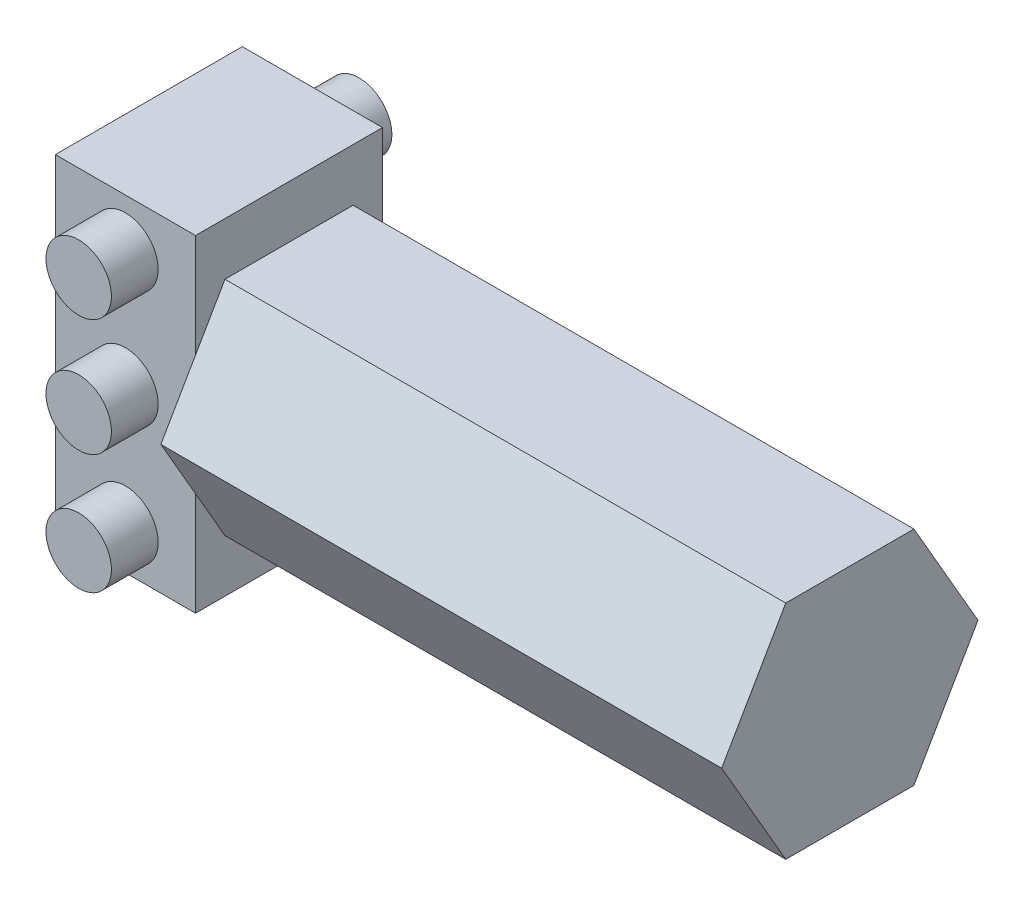
ISO-10303-21;
HEADER;
FILE_DESCRIPTION(('STEP AP214'),'2;1');
FILE_NAME('part.step','',(''),(''),'','','');
FILE_SCHEMA(('AUTOMOTIVE_DESIGN { 1 0 10303 214 1 1 1 1 }'));
ENDSEC;
DATA;
#1=APPLICATION_CONTEXT('core data for automotive mechanical design processes');
#2=APPLICATION_PROTOCOL_DEFINITION('international standard','automotive_design',2000,#1);
#3=PRODUCT_CONTEXT('',#1,'mechanical');
#4=PRODUCT('Part','Part','',(#3));
#5=PRODUCT_RELATED_PRODUCT_CATEGORY('part','',(#4));
#6=PRODUCT_DEFINITION_FORMATION('','',#4);
#7=PRODUCT_DEFINITION_CONTEXT('part definition',#1,'design');
#8=PRODUCT_DEFINITION('design','',#6,#7);
#9=PRODUCT_DEFINITION_SHAPE('','',#8);
#10=(LENGTH_UNIT() NAMED_UNIT(*) SI_UNIT(.MILLI.,.METRE.));
#11=(NAMED_UNIT(*) PLANE_ANGLE_UNIT() SI_UNIT($,.RADIAN.));
#12=(NAMED_UNIT(*) SI_UNIT($,.STERADIAN.) SOLID_ANGLE_UNIT());
#13=UNCERTAINTY_MEASURE_WITH_UNIT(LENGTH_MEASURE(1.E-05),#10,'distance_accuracy_value','');
#14=(GEOMETRIC_REPRESENTATION_CONTEXT(3) GLOBAL_UNCERTAINTY_ASSIGNED_CONTEXT((#13)) GLOBAL_UNIT_ASSIGNED_CONTEXT((#10,
#11,#12)) REPRESENTATION_CONTEXT('',''));
#15=CARTESIAN_POINT('',(0.,0.,0.));
#16=DIRECTION('',(0.,0.,1.));
#17=DIRECTION('',(1.,0.,0.));
#18=AXIS2_PLACEMENT_3D('',#15,#16,#17);
#19=CARTESIAN_POINT('',(7.62,0.,10.16));
#20=DIRECTION('',(-1.,0.,0.));
#21=DIRECTION('',(0.,0.,1.));
#22=AXIS2_PLACEMENT_3D('',#19,#20,#21);
#23=PLANE('',#22);
#24=DIRECTION('',(0.,0.866025403784439,-0.5));
#25=VECTOR('',#24,1.);
#26=CARTESIAN_POINT('',(7.62,2.85753030896035,1.597152));
#27=LINE('',#26,#25);
#28=CARTESIAN_POINT('',(7.62,2.85753030896035,1.597152));
#29=VERTEX_POINT('',#28);
#30=CARTESIAN_POINT('',(7.62,5.62387872037061,0.));
#31=VERTEX_POINT('',#30);
#32=EDGE_CURVE('E59',#29,#31,#27,.T.);
#33=ORIENTED_EDGE('',*,*,#32,.F.);
#34=DIRECTION('',(0.,0.,-1.));
#35=VECTOR('',#34,1.);
#36=CARTESIAN_POINT('',(7.62,2.85753030896035,8.56284799999999));
#37=LINE('',#36,#35);
#38=CARTESIAN_POINT('',(7.62,2.85753030896035,8.56284799999999));
#39=VERTEX_POINT('',#38);
#40=EDGE_CURVE('E63',#39,#29,#37,.T.);
#41=ORIENTED_EDGE('',*,*,#40,.F.);
#42=DIRECTION('',(0.,-0.866025403784439,-0.5));
#43=VECTOR('',#42,1.);
#44=CARTESIAN_POINT('',(7.62,8.89,12.045696));
#45=LINE('',#44,#43);
#46=CARTESIAN_POINT('',(7.62,5.62387872037061,10.16));
#47=VERTEX_POINT('',#46);
#48=EDGE_CURVE('E218',#47,#39,#45,.T.);
#49=ORIENTED_EDGE('',*,*,#48,.F.);
#50=DIRECTION('',(0.,1.,0.));
#51=VECTOR('',#50,1.);
#52=CARTESIAN_POINT('',(7.62,0.,10.16));
#53=LINE('',#52,#51);
#54=CARTESIAN_POINT('',(7.62,0.,10.16));
#55=VERTEX_POINT('',#54);
#56=EDGE_CURVE('E181',#55,#47,#53,.T.);
#57=ORIENTED_EDGE('',*,*,#56,.F.);
#58=DIRECTION('',(0.,0.,-1.));
#59=VECTOR('',#58,1.);
#60=CARTESIAN_POINT('',(7.62,0.,10.16));
#61=LINE('',#60,#59);
#62=CARTESIAN_POINT('',(7.62,0.,0.));
#63=VERTEX_POINT('',#62);
#64=EDGE_CURVE('E206',#55,#63,#61,.T.);
#65=ORIENTED_EDGE('',*,*,#64,.T.);
#66=DIRECTION('',(0.,1.,0.));
#67=VECTOR('',#66,1.);
#68=CARTESIAN_POINT('',(7.62,0.,0.));
#69=LINE('',#68,#67);
#70=EDGE_CURVE('E193',#63,#31,#69,.T.);
#71=ORIENTED_EDGE('',*,*,#70,.T.);
#72=EDGE_LOOP('',(#33,#41,#49,#57,#65,#71));
#73=FACE_BOUND('',#72,.T.);
#74=ADVANCED_FACE('F43',(#73),#23,.F.);
#75=DIRECTION('',(0.,-0.866025403784439,0.5));
#76=VECTOR('',#75,1.);
#77=CARTESIAN_POINT('',(7.62,14.9224696910396,8.56284799999999));
#78=LINE('',#77,#76);
#79=CARTESIAN_POINT('',(7.62,14.9224696910396,8.56284799999999));
#80=VERTEX_POINT('',#79);
#81=CARTESIAN_POINT('',(7.62,12.1561212796294,10.16));
#82=VERTEX_POINT('',#81);
#83=EDGE_CURVE('E265',#80,#82,#78,.T.);
#84=ORIENTED_EDGE('',*,*,#83,.F.);
#85=DIRECTION('',(0.,0.,1.));
#86=VECTOR('',#85,1.);
#87=CARTESIAN_POINT('',(7.62,14.9224696910396,1.597152));
#88=LINE('',#87,#86);
#89=CARTESIAN_POINT('',(7.62,14.9224696910396,1.597152));
#90=VERTEX_POINT('',#89);
#91=EDGE_CURVE('E278',#90,#80,#88,.T.);
#92=ORIENTED_EDGE('',*,*,#91,.F.);
#93=DIRECTION('',(0.,0.866025403784439,0.5));
#94=VECTOR('',#93,1.);
#95=CARTESIAN_POINT('',(7.62,8.89,-1.88569599999999));
#96=LINE('',#95,#94);
#97=CARTESIAN_POINT('',(7.62,12.1561212796294,0.));
#98=VERTEX_POINT('',#97);
#99=EDGE_CURVE('E214',#98,#90,#96,.T.);
#100=ORIENTED_EDGE('',*,*,#99,.F.);
#101=CARTESIAN_POINT('',(7.62,17.78,0.));
#102=VERTEX_POINT('',#101);
#103=EDGE_CURVE('E192',#98,#102,#69,.T.);
#104=ORIENTED_EDGE('',*,*,#103,.T.);
#105=DIRECTION('',(0.,0.,-1.));
#106=VECTOR('',#105,1.);
#107=CARTESIAN_POINT('',(7.62,17.78,10.16));
#108=LINE('',#107,#106);
#109=CARTESIAN_POINT('',(7.62,17.78,10.16));
#110=VERTEX_POINT('',#109);
#111=EDGE_CURVE('E202',#110,#102,#108,.T.);
#112=ORIENTED_EDGE('',*,*,#111,.F.);
#113=EDGE_CURVE('E180',#82,#110,#53,.T.);
#114=ORIENTED_EDGE('',*,*,#113,.F.);
#115=EDGE_LOOP('',(#84,#92,#100,#104,#112,#114));
#116=FACE_BOUND('',#115,.T.);
#117=ADVANCED_FACE('F348',(#116),#23,.F.);
#118=CARTESIAN_POINT('',(0.,0.,10.16));
#119=DIRECTION('',(1.,0.,0.));
#120=DIRECTION('',(0.,0.,-1.));
#121=AXIS2_PLACEMENT_3D('',#118,#119,#120);
#122=PLANE('',#121);
#123=DIRECTION('',(0.,-1.,0.));
#124=VECTOR('',#123,1.);
#125=CARTESIAN_POINT('',(0.,0.,0.));
#126=LINE('',#125,#124);
#127=CARTESIAN_POINT('',(0.,17.78,0.));
#128=VERTEX_POINT('',#127);
#129=CARTESIAN_POINT('',(0.,0.,0.));
#130=VERTEX_POINT('',#129);
#131=EDGE_CURVE('E161',#128,#130,#126,.T.);
#132=ORIENTED_EDGE('',*,*,#131,.T.);
#133=DIRECTION('',(0.,0.,-1.));
#134=VECTOR('',#133,1.);
#135=CARTESIAN_POINT('',(0.,0.,10.16));
#136=LINE('',#135,#134);
#137=CARTESIAN_POINT('',(0.,0.,10.16));
#138=VERTEX_POINT('',#137);
#139=EDGE_CURVE('E210',#138,#130,#136,.T.);
#140=ORIENTED_EDGE('',*,*,#139,.F.);
#141=DIRECTION('',(0.,-1.,0.));
#142=VECTOR('',#141,1.);
#143=CARTESIAN_POINT('',(0.,0.,10.16));
#144=LINE('',#143,#142);
#145=CARTESIAN_POINT('',(0.,17.78,10.16));
#146=VERTEX_POINT('',#145);
#147=EDGE_CURVE('E172',#146,#138,#144,.T.);
#148=ORIENTED_EDGE('',*,*,#147,.F.);
#149=DIRECTION('',(0.,0.,-1.));
#150=VECTOR('',#149,1.);
#151=CARTESIAN_POINT('',(0.,17.78,10.16));
#152=LINE('',#151,#150);
#153=EDGE_CURVE('E188',#146,#128,#152,.T.);
#154=ORIENTED_EDGE('',*,*,#153,.T.);
#155=EDGE_LOOP('',(#132,#140,#148,#154));
#156=FACE_BOUND('',#155,.T.);
#157=ADVANCED_FACE('F45',(#156),#122,.F.);
#158=CARTESIAN_POINT('',(0.,0.,10.16));
#159=DIRECTION('',(0.,1.,0.));
#160=DIRECTION('',(0.,0.,1.));
#161=AXIS2_PLACEMENT_3D('',#158,#159,#160);
#162=PLANE('',#161);
#163=DIRECTION('',(1.,0.,0.));
#164=VECTOR('',#163,1.);
#165=CARTESIAN_POINT('',(0.,0.,0.));
#166=LINE('',#165,#164);
#167=EDGE_CURVE('E166',#130,#63,#166,.T.);
#168=ORIENTED_EDGE('',*,*,#167,.T.);
#169=ORIENTED_EDGE('',*,*,#64,.F.);
#170=DIRECTION('',(1.,0.,0.));
#171=VECTOR('',#170,1.);
#172=CARTESIAN_POINT('',(0.,0.,10.16));
#173=LINE('',#172,#171);
#174=EDGE_CURVE('E176',#138,#55,#173,.T.);
#175=ORIENTED_EDGE('',*,*,#174,.F.);
#176=ORIENTED_EDGE('',*,*,#139,.T.);
#177=EDGE_LOOP('',(#168,#169,#175,#176));
#178=FACE_BOUND('',#177,.T.);
#179=ADVANCED_FACE('F242',(#178),#162,.F.);
#180=CARTESIAN_POINT('',(0.,17.78,10.16));
#181=DIRECTION('',(0.,-1.,0.));
#182=DIRECTION('',(0.,0.,-1.));
#183=AXIS2_PLACEMENT_3D('',#180,#181,#182);
#184=PLANE('',#183);
#185=DIRECTION('',(-1.,0.,0.));
#186=VECTOR('',#185,1.);
#187=CARTESIAN_POINT('',(0.,17.78,0.));
#188=LINE('',#187,#186);
#189=EDGE_CURVE('E177',#102,#128,#188,.T.);
#190=ORIENTED_EDGE('',*,*,#189,.T.);
#191=ORIENTED_EDGE('',*,*,#153,.F.);
#192=DIRECTION('',(-1.,0.,0.));
#193=VECTOR('',#192,1.);
#194=CARTESIAN_POINT('',(0.,17.78,10.16));
#195=LINE('',#194,#193);
#196=EDGE_CURVE('E185',#110,#146,#195,.T.);
#197=ORIENTED_EDGE('',*,*,#196,.F.);
#198=ORIENTED_EDGE('',*,*,#111,.T.);
#199=EDGE_LOOP('',(#190,#191,#197,#198));
#200=FACE_BOUND('',#199,.T.);
#201=ADVANCED_FACE('F229',(#200),#184,.F.);
#202=CARTESIAN_POINT('',(0.,0.,10.16));
#203=DIRECTION('',(0.,0.,-1.));
#204=DIRECTION('',(-1.,0.,0.));
#205=AXIS2_PLACEMENT_3D('',#202,#203,#204);
#206=PLANE('',#205);
#207=CARTESIAN_POINT('',(3.81,2.31394822006476,10.16));
#208=DIRECTION('',(0.,0.,-1.));
#209=DIRECTION('',(-1.,0.,0.));
#210=AXIS2_PLACEMENT_3D('',#207,#208,#209);
#211=CIRCLE('',#210,1.778);
#212=CARTESIAN_POINT('',(2.032,2.31394822006476,10.16));
#213=VERTEX_POINT('',#212);
#214=EDGE_CURVE('E11',#213,#213,#211,.F.);
#215=ORIENTED_EDGE('',*,*,#214,.F.);
#216=EDGE_LOOP('',(#215));
#217=FACE_BOUND('',#216,.T.);
#218=CARTESIAN_POINT('',(3.81,8.81714033539279,10.16));
#219=DIRECTION('',(0.,0.,-1.));
#220=DIRECTION('',(-1.,0.,0.));
#221=AXIS2_PLACEMENT_3D('',#218,#219,#220);
#222=CIRCLE('',#221,1.778);
#223=CARTESIAN_POINT('',(2.032,8.81714033539279,10.16));
#224=VERTEX_POINT('',#223);
#225=EDGE_CURVE('E52',#224,#224,#222,.F.);
#226=ORIENTED_EDGE('',*,*,#225,.F.);
#227=EDGE_LOOP('',(#226));
#228=FACE_BOUND('',#227,.T.);
#229=CARTESIAN_POINT('',(3.81,15.1671403353928,10.16));
#230=DIRECTION('',(0.,0.,-1.));
#231=DIRECTION('',(-1.,0.,0.));
#232=AXIS2_PLACEMENT_3D('',#229,#230,#231);
#233=CIRCLE('',#232,1.778);
#234=CARTESIAN_POINT('',(2.032,15.1671403353928,10.16));
#235=VERTEX_POINT('',#234);
#236=EDGE_CURVE('E215',#235,#235,#233,.F.);
#237=ORIENTED_EDGE('',*,*,#236,.F.);
#238=EDGE_LOOP('',(#237));
#239=FACE_BOUND('',#238,.T.);
#240=ORIENTED_EDGE('',*,*,#147,.T.);
#241=ORIENTED_EDGE('',*,*,#174,.T.);
#242=ORIENTED_EDGE('',*,*,#56,.T.);
#243=EDGE_CURVE('E186',#47,#82,#53,.T.);
#244=ORIENTED_EDGE('',*,*,#243,.T.);
#245=ORIENTED_EDGE('',*,*,#113,.T.);
#246=ORIENTED_EDGE('',*,*,#196,.T.);
#247=EDGE_LOOP('',(#240,#241,#242,#244,#245,#246));
#248=FACE_BOUND('',#247,.T.);
#249=ADVANCED_FACE('F225',(#217,#228,#239,#248),#206,.F.);
#250=CARTESIAN_POINT('',(0.,0.,0.));
#251=DIRECTION('',(0.,0.,-1.));
#252=DIRECTION('',(-1.,0.,0.));
#253=AXIS2_PLACEMENT_3D('',#250,#251,#252);
#254=PLANE('',#253);
#255=CARTESIAN_POINT('',(3.81,2.31394822006476,0.));
#256=DIRECTION('',(0.,0.,-1.));
#257=DIRECTION('',(-1.,0.,0.));
#258=AXIS2_PLACEMENT_3D('',#255,#256,#257);
#259=CIRCLE('',#258,1.72135793558427);
#260=CARTESIAN_POINT('',(2.08864206441573,2.31394822006476,0.));
#261=VERTEX_POINT('',#260);
#262=EDGE_CURVE('E308',#261,#261,#259,.T.);
#263=ORIENTED_EDGE('',*,*,#262,.F.);
#264=EDGE_LOOP('',(#263));
#265=FACE_BOUND('',#264,.T.);
#266=CARTESIAN_POINT('',(3.81,8.81714033539279,0.));
#267=DIRECTION('',(0.,0.,-1.));
#268=DIRECTION('',(-1.,0.,0.));
#269=AXIS2_PLACEMENT_3D('',#266,#267,#268);
#270=CIRCLE('',#269,1.778);
#271=CARTESIAN_POINT('',(2.032,8.81714033539279,0.));
#272=VERTEX_POINT('',#271);
#273=EDGE_CURVE('E300',#272,#272,#270,.T.);
#274=ORIENTED_EDGE('',*,*,#273,.F.);
#275=EDGE_LOOP('',(#274));
#276=FACE_BOUND('',#275,.T.);
#277=CARTESIAN_POINT('',(3.81,15.1671403353928,0.));
#278=DIRECTION('',(0.,0.,-1.));
#279=DIRECTION('',(-1.,0.,0.));
#280=AXIS2_PLACEMENT_3D('',#277,#278,#279);
#281=CIRCLE('',#280,1.778);
#282=CARTESIAN_POINT('',(2.032,15.1671403353928,0.));
#283=VERTEX_POINT('',#282);
#284=EDGE_CURVE('E296',#283,#283,#281,.T.);
#285=ORIENTED_EDGE('',*,*,#284,.F.);
#286=EDGE_LOOP('',(#285));
#287=FACE_BOUND('',#286,.T.);
#288=ORIENTED_EDGE('',*,*,#131,.F.);
#289=ORIENTED_EDGE('',*,*,#189,.F.);
#290=ORIENTED_EDGE('',*,*,#103,.F.);
#291=EDGE_CURVE('E196',#31,#98,#69,.T.);
#292=ORIENTED_EDGE('',*,*,#291,.F.);
#293=ORIENTED_EDGE('',*,*,#70,.F.);
#294=ORIENTED_EDGE('',*,*,#167,.F.);
#295=EDGE_LOOP('',(#288,#289,#290,#292,#293,#294));
#296=FACE_BOUND('',#295,.T.);
#297=ADVANCED_FACE('F228',(#265,#276,#287,#296),#254,.T.);
#298=CARTESIAN_POINT('',(7.62,0.,0.));
#299=DIRECTION('',(1.,0.,0.));
#300=DIRECTION('',(0.,0.,-1.));
#301=AXIS2_PLACEMENT_3D('',#298,#299,#300);
#302=PLANE('',#301);
#303=CARTESIAN_POINT('',(7.62,8.89,-1.88569599999999));
#304=VERTEX_POINT('',#303);
#305=EDGE_CURVE('E158',#31,#304,#27,.T.);
#306=ORIENTED_EDGE('',*,*,#305,.F.);
#307=ORIENTED_EDGE('',*,*,#291,.T.);
#308=EDGE_CURVE('E274',#304,#98,#96,.T.);
#309=ORIENTED_EDGE('',*,*,#308,.F.);
#310=EDGE_LOOP('',(#306,#307,#309));
#311=FACE_BOUND('',#310,.T.);
#312=ADVANCED_FACE('F377',(#311),#302,.F.);
#313=CARTESIAN_POINT('',(38.1,2.85753030896035,1.597152));
#314=DIRECTION('',(0.,0.5,0.866025403784439));
#315=DIRECTION('',(0.,-0.866025403784439,0.5));
#316=AXIS2_PLACEMENT_3D('',#313,#314,#315);
#317=PLANE('',#316);
#318=ORIENTED_EDGE('',*,*,#32,.T.);
#319=ORIENTED_EDGE('',*,*,#305,.T.);
#320=DIRECTION('',(-1.,0.,0.));
#321=VECTOR('',#320,1.);
#322=CARTESIAN_POINT('',(38.1,8.89,-1.88569599999999));
#323=LINE('',#322,#321);
#324=CARTESIAN_POINT('',(38.1,8.89,-1.88569599999999));
#325=VERTEX_POINT('',#324);
#326=EDGE_CURVE('E137',#325,#304,#323,.T.);
#327=ORIENTED_EDGE('',*,*,#326,.F.);
#328=DIRECTION('',(0.,0.866025403784439,-0.5));
#329=VECTOR('',#328,1.);
#330=CARTESIAN_POINT('',(38.1,2.85753030896035,1.597152));
#331=LINE('',#330,#329);
#332=CARTESIAN_POINT('',(38.1,2.85753030896035,1.597152));
#333=VERTEX_POINT('',#332);
#334=EDGE_CURVE('E145',#333,#325,#331,.T.);
#335=ORIENTED_EDGE('',*,*,#334,.F.);
#336=DIRECTION('',(-1.,0.,0.));
#337=VECTOR('',#336,1.);
#338=CARTESIAN_POINT('',(38.1,2.85753030896035,1.597152));
#339=LINE('',#338,#337);
#340=EDGE_CURVE('E287',#333,#29,#339,.T.);
#341=ORIENTED_EDGE('',*,*,#340,.T.);
#342=EDGE_LOOP('',(#318,#319,#327,#335,#341));
#343=FACE_BOUND('',#342,.T.);
#344=ADVANCED_FACE('F156',(#343),#317,.F.);
#345=CARTESIAN_POINT('',(38.1,8.89,-1.88569599999999));
#346=DIRECTION('',(0.,-0.5,0.866025403784439));
#347=DIRECTION('',(0.,-0.866025403784439,-0.5));
#348=AXIS2_PLACEMENT_3D('',#345,#346,#347);
#349=PLANE('',#348);
#350=ORIENTED_EDGE('',*,*,#308,.T.);
#351=ORIENTED_EDGE('',*,*,#99,.T.);
#352=DIRECTION('',(-1.,0.,0.));
#353=VECTOR('',#352,1.);
#354=CARTESIAN_POINT('',(38.1,14.9224696910396,1.597152));
#355=LINE('',#354,#353);
#356=CARTESIAN_POINT('',(38.1,14.9224696910396,1.597152));
#357=VERTEX_POINT('',#356);
#358=EDGE_CURVE('E140',#357,#90,#355,.T.);
#359=ORIENTED_EDGE('',*,*,#358,.F.);
#360=DIRECTION('',(0.,0.866025403784439,0.5));
#361=VECTOR('',#360,1.);
#362=CARTESIAN_POINT('',(38.1,8.89,-1.88569599999999));
#363=LINE('',#362,#361);
#364=EDGE_CURVE('E132',#325,#357,#363,.T.);
#365=ORIENTED_EDGE('',*,*,#364,.F.);
#366=ORIENTED_EDGE('',*,*,#326,.T.);
#367=EDGE_LOOP('',(#350,#351,#359,#365,#366));
#368=FACE_BOUND('',#367,.T.);
#369=ADVANCED_FACE('F135',(#368),#349,.F.);
#370=CARTESIAN_POINT('',(38.1,14.9224696910396,1.597152));
#371=DIRECTION('',(0.,-1.,0.));
#372=DIRECTION('',(0.,0.,-1.));
#373=AXIS2_PLACEMENT_3D('',#370,#371,#372);
#374=PLANE('',#373);
#375=ORIENTED_EDGE('',*,*,#91,.T.);
#376=DIRECTION('',(-1.,0.,0.));
#377=VECTOR('',#376,1.);
#378=CARTESIAN_POINT('',(38.1,14.9224696910396,8.56284799999999));
#379=LINE('',#378,#377);
#380=CARTESIAN_POINT('',(38.1,14.9224696910396,8.56284799999999));
#381=VERTEX_POINT('',#380);
#382=EDGE_CURVE('E168',#381,#80,#379,.T.);
#383=ORIENTED_EDGE('',*,*,#382,.F.);
#384=DIRECTION('',(0.,0.,1.));
#385=VECTOR('',#384,1.);
#386=CARTESIAN_POINT('',(38.1,14.9224696910396,1.597152));
#387=LINE('',#386,#385);
#388=EDGE_CURVE('E144',#357,#381,#387,.T.);
#389=ORIENTED_EDGE('',*,*,#388,.F.);
#390=ORIENTED_EDGE('',*,*,#358,.T.);
#391=EDGE_LOOP('',(#375,#383,#389,#390));
#392=FACE_BOUND('',#391,.T.);
#393=ADVANCED_FACE('F403',(#392),#374,.F.);
#394=CARTESIAN_POINT('',(38.1,14.9224696910396,8.56284799999999));
#395=DIRECTION('',(0.,-0.5,-0.866025403784439));
#396=DIRECTION('',(0.,0.866025403784439,-0.5));
#397=AXIS2_PLACEMENT_3D('',#394,#395,#396);
#398=PLANE('',#397);
#399=ORIENTED_EDGE('',*,*,#83,.T.);
#400=CARTESIAN_POINT('',(7.62,8.89,12.045696));
#401=VERTEX_POINT('',#400);
#402=EDGE_CURVE('E253',#82,#401,#78,.T.);
#403=ORIENTED_EDGE('',*,*,#402,.T.);
#404=DIRECTION('',(-1.,0.,0.));
#405=VECTOR('',#404,1.);
#406=CARTESIAN_POINT('',(38.1,8.89,12.045696));
#407=LINE('',#406,#405);
#408=CARTESIAN_POINT('',(38.1,8.89,12.045696));
#409=VERTEX_POINT('',#408);
#410=EDGE_CURVE('E263',#409,#401,#407,.T.);
#411=ORIENTED_EDGE('',*,*,#410,.F.);
#412=DIRECTION('',(0.,-0.866025403784439,0.5));
#413=VECTOR('',#412,1.);
#414=CARTESIAN_POINT('',(38.1,14.9224696910396,8.56284799999999));
#415=LINE('',#414,#413);
#416=EDGE_CURVE('E291',#381,#409,#415,.T.);
#417=ORIENTED_EDGE('',*,*,#416,.F.);
#418=ORIENTED_EDGE('',*,*,#382,.T.);
#419=EDGE_LOOP('',(#399,#403,#411,#417,#418));
#420=FACE_BOUND('',#419,.T.);
#421=ADVANCED_FACE('F413',(#420),#398,.F.);
#422=CARTESIAN_POINT('',(38.1,8.89,12.045696));
#423=DIRECTION('',(0.,0.5,-0.866025403784439));
#424=DIRECTION('',(0.,0.866025403784439,0.5));
#425=AXIS2_PLACEMENT_3D('',#422,#423,#424);
#426=PLANE('',#425);
#427=EDGE_CURVE('E252',#401,#47,#45,.T.);
#428=ORIENTED_EDGE('',*,*,#427,.T.);
#429=ORIENTED_EDGE('',*,*,#48,.T.);
#430=DIRECTION('',(-1.,0.,0.));
#431=VECTOR('',#430,1.);
#432=CARTESIAN_POINT('',(38.1,2.85753030896035,8.56284799999999));
#433=LINE('',#432,#431);
#434=CARTESIAN_POINT('',(38.1,2.85753030896035,8.56284799999999));
#435=VERTEX_POINT('',#434);
#436=EDGE_CURVE('E664',#435,#39,#433,.T.);
#437=ORIENTED_EDGE('',*,*,#436,.F.);
#438=DIRECTION('',(0.,-0.866025403784439,-0.5));
#439=VECTOR('',#438,1.);
#440=CARTESIAN_POINT('',(38.1,8.89,12.045696));
#441=LINE('',#440,#439);
#442=EDGE_CURVE('E288',#409,#435,#441,.T.);
#443=ORIENTED_EDGE('',*,*,#442,.F.);
#444=ORIENTED_EDGE('',*,*,#410,.T.);
#445=EDGE_LOOP('',(#428,#429,#437,#443,#444));
#446=FACE_BOUND('',#445,.T.);
#447=ADVANCED_FACE('F258',(#446),#426,.F.);
#448=CARTESIAN_POINT('',(38.1,2.85753030896035,8.56284799999999));
#449=DIRECTION('',(0.,1.,0.));
#450=DIRECTION('',(0.,0.,1.));
#451=AXIS2_PLACEMENT_3D('',#448,#449,#450);
#452=PLANE('',#451);
#453=ORIENTED_EDGE('',*,*,#40,.T.);
#454=ORIENTED_EDGE('',*,*,#340,.F.);
#455=DIRECTION('',(0.,0.,-1.));
#456=VECTOR('',#455,1.);
#457=CARTESIAN_POINT('',(38.1,2.85753030896035,8.56284799999999));
#458=LINE('',#457,#456);
#459=EDGE_CURVE('E150',#435,#333,#458,.T.);
#460=ORIENTED_EDGE('',*,*,#459,.F.);
#461=ORIENTED_EDGE('',*,*,#436,.T.);
#462=EDGE_LOOP('',(#453,#454,#460,#461));
#463=FACE_BOUND('',#462,.T.);
#464=ADVANCED_FACE('F434',(#463),#452,.F.);
#465=CARTESIAN_POINT('',(38.1,0.,0.));
#466=DIRECTION('',(1.,0.,0.));
#467=DIRECTION('',(0.,0.,-1.));
#468=AXIS2_PLACEMENT_3D('',#465,#466,#467);
#469=PLANE('',#468);
#470=ORIENTED_EDGE('',*,*,#334,.T.);
#471=ORIENTED_EDGE('',*,*,#364,.T.);
#472=ORIENTED_EDGE('',*,*,#388,.T.);
#473=ORIENTED_EDGE('',*,*,#416,.T.);
#474=ORIENTED_EDGE('',*,*,#442,.T.);
#475=ORIENTED_EDGE('',*,*,#459,.T.);
#476=EDGE_LOOP('',(#470,#471,#472,#473,#474,#475));
#477=FACE_BOUND('',#476,.T.);
#478=ADVANCED_FACE('F148',(#477),#469,.T.);
#479=ORIENTED_EDGE('',*,*,#243,.F.);
#480=ORIENTED_EDGE('',*,*,#427,.F.);
#481=ORIENTED_EDGE('',*,*,#402,.F.);
#482=EDGE_LOOP('',(#479,#480,#481));
#483=FACE_BOUND('',#482,.T.);
#484=ADVANCED_FACE('F251',(#483),#302,.F.);
#485=CARTESIAN_POINT('',(3.81,15.1671403353928,-2.54));
#486=DIRECTION('',(0.,0.,1.));
#487=DIRECTION('',(1.,0.,0.));
#488=AXIS2_PLACEMENT_3D('',#485,#486,#487);
#489=CYLINDRICAL_SURFACE('',#488,1.778);
#490=CARTESIAN_POINT('',(3.81,15.1671403353928,-2.54));
#491=DIRECTION('',(0.,0.,-1.));
#492=DIRECTION('',(-1.,0.,0.));
#493=AXIS2_PLACEMENT_3D('',#490,#491,#492);
#494=CIRCLE('',#493,1.778);
#495=CARTESIAN_POINT('',(2.032,15.1671403353928,-2.54));
#496=VERTEX_POINT('',#495);
#497=EDGE_CURVE('E283',#496,#496,#494,.T.);
#498=ORIENTED_EDGE('',*,*,#497,.F.);
#499=EDGE_LOOP('',(#498));
#500=FACE_BOUND('',#499,.T.);
#501=ORIENTED_EDGE('',*,*,#284,.T.);
#502=EDGE_LOOP('',(#501));
#503=FACE_BOUND('',#502,.T.);
#504=ADVANCED_FACE('F463',(#500,#503),#489,.T.);
#505=CARTESIAN_POINT('',(3.81,15.1671403353928,-2.54));
#506=DIRECTION('',(0.,0.,-1.));
#507=DIRECTION('',(-1.,0.,0.));
#508=AXIS2_PLACEMENT_3D('',#505,#506,#507);
#509=PLANE('',#508);
#510=ORIENTED_EDGE('',*,*,#497,.T.);
#511=EDGE_LOOP('',(#510));
#512=FACE_BOUND('',#511,.T.);
#513=ADVANCED_FACE('F480',(#512),#509,.T.);
#514=CARTESIAN_POINT('',(3.81,8.81714033539279,-2.54));
#515=DIRECTION('',(0.,0.,1.));
#516=DIRECTION('',(1.,0.,0.));
#517=AXIS2_PLACEMENT_3D('',#514,#515,#516);
#518=CYLINDRICAL_SURFACE('',#517,1.778);
#519=CARTESIAN_POINT('',(3.81,8.81714033539279,-2.54));
#520=DIRECTION('',(0.,0.,-1.));
#521=DIRECTION('',(-1.,0.,0.));
#522=AXIS2_PLACEMENT_3D('',#519,#520,#521);
#523=CIRCLE('',#522,1.778);
#524=CARTESIAN_POINT('',(2.032,8.81714033539279,-2.54));
#525=VERTEX_POINT('',#524);
#526=EDGE_CURVE('E304',#525,#525,#523,.T.);
#527=ORIENTED_EDGE('',*,*,#526,.F.);
#528=EDGE_LOOP('',(#527));
#529=FACE_BOUND('',#528,.T.);
#530=ORIENTED_EDGE('',*,*,#273,.T.);
#531=EDGE_LOOP('',(#530));
#532=FACE_BOUND('',#531,.T.);
#533=ADVANCED_FACE('F491',(#529,#532),#518,.T.);
#534=CARTESIAN_POINT('',(3.81,8.81714033539279,-2.54));
#535=DIRECTION('',(0.,0.,-1.));
#536=DIRECTION('',(-1.,0.,0.));
#537=AXIS2_PLACEMENT_3D('',#534,#535,#536);
#538=PLANE('',#537);
#539=ORIENTED_EDGE('',*,*,#526,.T.);
#540=EDGE_LOOP('',(#539));
#541=FACE_BOUND('',#540,.T.);
#542=ADVANCED_FACE('F502',(#541),#538,.T.);
#543=CARTESIAN_POINT('',(3.81,2.31394822006476,-2.54));
#544=DIRECTION('',(0.,0.,1.));
#545=DIRECTION('',(1.,0.,0.));
#546=AXIS2_PLACEMENT_3D('',#543,#544,#545);
#547=CYLINDRICAL_SURFACE('',#546,1.72135793558427);
#548=CARTESIAN_POINT('',(3.81,2.31394822006476,-2.54));
#549=DIRECTION('',(0.,0.,-1.));
#550=DIRECTION('',(-1.,0.,0.));
#551=AXIS2_PLACEMENT_3D('',#548,#549,#550);
#552=CIRCLE('',#551,1.72135793558427);
#553=CARTESIAN_POINT('',(2.08864206441573,2.31394822006476,-2.54));
#554=VERTEX_POINT('',#553);
#555=EDGE_CURVE('E312',#554,#554,#552,.T.);
#556=ORIENTED_EDGE('',*,*,#555,.F.);
#557=EDGE_LOOP('',(#556));
#558=FACE_BOUND('',#557,.T.);
#559=ORIENTED_EDGE('',*,*,#262,.T.);
#560=EDGE_LOOP('',(#559));
#561=FACE_BOUND('',#560,.T.);
#562=ADVANCED_FACE('F513',(#558,#561),#547,.T.);
#563=CARTESIAN_POINT('',(3.81,2.31394822006476,-2.54));
#564=DIRECTION('',(0.,0.,-1.));
#565=DIRECTION('',(-1.,0.,0.));
#566=AXIS2_PLACEMENT_3D('',#563,#564,#565);
#567=PLANE('',#566);
#568=ORIENTED_EDGE('',*,*,#555,.T.);
#569=EDGE_LOOP('',(#568));
#570=FACE_BOUND('',#569,.T.);
#571=ADVANCED_FACE('F524',(#570),#567,.T.);
#572=CARTESIAN_POINT('',(3.81,15.1671403353928,12.7));
#573=DIRECTION('',(0.,0.,-1.));
#574=DIRECTION('',(-1.,0.,0.));
#575=AXIS2_PLACEMENT_3D('',#572,#573,#574);
#576=CYLINDRICAL_SURFACE('',#575,1.778);
#577=CARTESIAN_POINT('',(3.81,15.1671403353928,12.7));
#578=DIRECTION('',(0.,0.,1.));
#579=DIRECTION('',(1.,0.,0.));
#580=AXIS2_PLACEMENT_3D('',#577,#578,#579);
#581=CIRCLE('',#580,1.778);
#582=CARTESIAN_POINT('',(5.588,15.1671403353928,12.7));
#583=VERTEX_POINT('',#582);
#584=EDGE_CURVE('E316',#583,#583,#581,.T.);
#585=ORIENTED_EDGE('',*,*,#584,.F.);
#586=EDGE_LOOP('',(#585));
#587=FACE_BOUND('',#586,.T.);
#588=ORIENTED_EDGE('',*,*,#236,.T.);
#589=EDGE_LOOP('',(#588));
#590=FACE_BOUND('',#589,.T.);
#591=ADVANCED_FACE('F535',(#587,#590),#576,.T.);
#592=CARTESIAN_POINT('',(3.81,15.1671403353928,12.7));
#593=DIRECTION('',(0.,0.,1.));
#594=DIRECTION('',(1.,0.,0.));
#595=AXIS2_PLACEMENT_3D('',#592,#593,#594);
#596=PLANE('',#595);
#597=ORIENTED_EDGE('',*,*,#584,.T.);
#598=EDGE_LOOP('',(#597));
#599=FACE_BOUND('',#598,.T.);
#600=ADVANCED_FACE('F553',(#599),#596,.T.);
#601=CARTESIAN_POINT('',(3.81,8.81714033539279,12.7));
#602=DIRECTION('',(0.,0.,-1.));
#603=DIRECTION('',(-1.,0.,0.));
#604=AXIS2_PLACEMENT_3D('',#601,#602,#603);
#605=CYLINDRICAL_SURFACE('',#604,1.778);
#606=CARTESIAN_POINT('',(3.81,8.81714033539279,12.7));
#607=DIRECTION('',(0.,0.,1.));
#608=DIRECTION('',(1.,0.,0.));
#609=AXIS2_PLACEMENT_3D('',#606,#607,#608);
#610=CIRCLE('',#609,1.778);
#611=CARTESIAN_POINT('',(5.588,8.81714033539279,12.7));
#612=VERTEX_POINT('',#611);
#613=EDGE_CURVE('E323',#612,#612,#610,.T.);
#614=ORIENTED_EDGE('',*,*,#613,.F.);
#615=EDGE_LOOP('',(#614));
#616=FACE_BOUND('',#615,.T.);
#617=ORIENTED_EDGE('',*,*,#225,.T.);
#618=EDGE_LOOP('',(#617));
#619=FACE_BOUND('',#618,.T.);
#620=ADVANCED_FACE('F223',(#616,#619),#605,.T.);
#621=CARTESIAN_POINT('',(3.81,8.81714033539279,12.7));
#622=DIRECTION('',(0.,0.,1.));
#623=DIRECTION('',(1.,0.,0.));
#624=AXIS2_PLACEMENT_3D('',#621,#622,#623);
#625=PLANE('',#624);
#626=ORIENTED_EDGE('',*,*,#613,.T.);
#627=EDGE_LOOP('',(#626));
#628=FACE_BOUND('',#627,.T.);
#629=ADVANCED_FACE('F337',(#628),#625,.T.);
#630=CARTESIAN_POINT('',(3.81,2.31394822006476,12.7));
#631=DIRECTION('',(0.,0.,-1.));
#632=DIRECTION('',(-1.,0.,0.));
#633=AXIS2_PLACEMENT_3D('',#630,#631,#632);
#634=CYLINDRICAL_SURFACE('',#633,1.778);
#635=CARTESIAN_POINT('',(3.81,2.31394822006476,12.7));
#636=DIRECTION('',(0.,0.,1.));
#637=DIRECTION('',(1.,0.,0.));
#638=AXIS2_PLACEMENT_3D('',#635,#636,#637);
#639=CIRCLE('',#638,1.778);
#640=CARTESIAN_POINT('',(5.588,2.31394822006476,12.7));
#641=VERTEX_POINT('',#640);
#642=EDGE_CURVE('E327',#641,#641,#639,.T.);
#643=ORIENTED_EDGE('',*,*,#642,.F.);
#644=EDGE_LOOP('',(#643));
#645=FACE_BOUND('',#644,.T.);
#646=ORIENTED_EDGE('',*,*,#214,.T.);
#647=EDGE_LOOP('',(#646));
#648=FACE_BOUND('',#647,.T.);
#649=ADVANCED_FACE('F334',(#645,#648),#634,.T.);
#650=CARTESIAN_POINT('',(3.81,2.31394822006476,12.7));
#651=DIRECTION('',(0.,0.,1.));
#652=DIRECTION('',(1.,0.,0.));
#653=AXIS2_PLACEMENT_3D('',#650,#651,#652);
#654=PLANE('',#653);
#655=ORIENTED_EDGE('',*,*,#642,.T.);
#656=EDGE_LOOP('',(#655));
#657=FACE_BOUND('',#656,.T.);
#658=ADVANCED_FACE('F332',(#657),#654,.T.);
#659=CLOSED_SHELL('',(#74,#117,#157,#179,#201,#249,#297,#312,#344,#369,#393,#421,#447,#464,#478,
#484,#504,#513,#533,#542,#562,#571,#591,#600,#620,#629,#649,#658));
#660=MANIFOLD_SOLID_BREP('B2',#659);
#661=ADVANCED_BREP_SHAPE_REPRESENTATION('',(#18,#660),#14);
#662=SHAPE_DEFINITION_REPRESENTATION(#9,#661);
ENDSEC;
END-ISO-10303-21;
